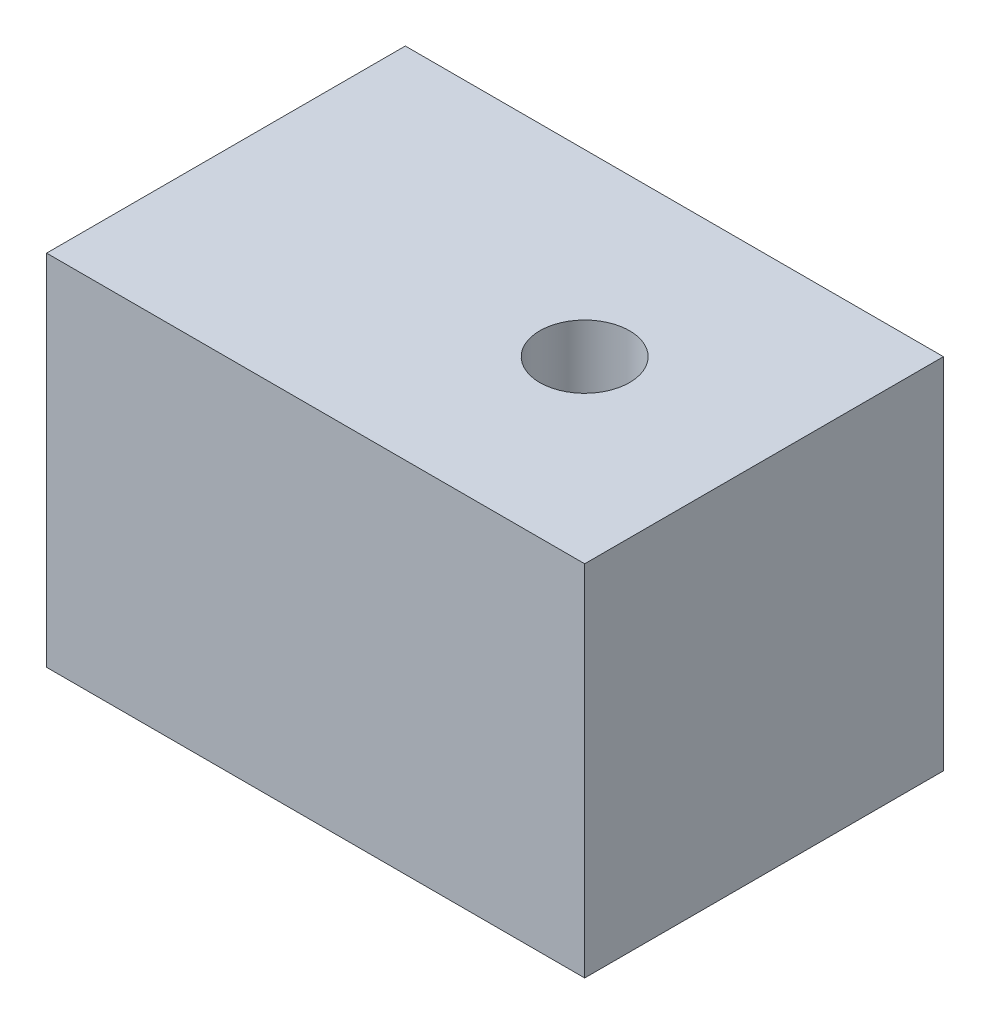
ISO-10303-21;
HEADER;
FILE_DESCRIPTION(('STEP AP214'),'2;1');
FILE_NAME('part.step','',(''),(''),'','','');
FILE_SCHEMA(('AUTOMOTIVE_DESIGN { 1 0 10303 214 1 1 1 1 }'));
ENDSEC;
DATA;
#1=APPLICATION_CONTEXT('core data for automotive mechanical design processes');
#2=APPLICATION_PROTOCOL_DEFINITION('international standard','automotive_design',2000,#1);
#3=PRODUCT_CONTEXT('',#1,'mechanical');
#4=PRODUCT('Part','Part','',(#3));
#5=PRODUCT_RELATED_PRODUCT_CATEGORY('part','',(#4));
#6=PRODUCT_DEFINITION_FORMATION('','',#4);
#7=PRODUCT_DEFINITION_CONTEXT('part definition',#1,'design');
#8=PRODUCT_DEFINITION('design','',#6,#7);
#9=PRODUCT_DEFINITION_SHAPE('','',#8);
#10=(LENGTH_UNIT() NAMED_UNIT(*) SI_UNIT(.MILLI.,.METRE.));
#11=(NAMED_UNIT(*) PLANE_ANGLE_UNIT() SI_UNIT($,.RADIAN.));
#12=(NAMED_UNIT(*) SI_UNIT($,.STERADIAN.) SOLID_ANGLE_UNIT());
#13=UNCERTAINTY_MEASURE_WITH_UNIT(LENGTH_MEASURE(1.E-05),#10,'distance_accuracy_value','');
#14=(GEOMETRIC_REPRESENTATION_CONTEXT(3) GLOBAL_UNCERTAINTY_ASSIGNED_CONTEXT((#13)) GLOBAL_UNIT_ASSIGNED_CONTEXT((#10,
#11,#12)) REPRESENTATION_CONTEXT('',''));
#15=CARTESIAN_POINT('',(0.,0.,0.));
#16=DIRECTION('',(0.,0.,1.));
#17=DIRECTION('',(1.,0.,0.));
#18=AXIS2_PLACEMENT_3D('',#15,#16,#17);
#19=CARTESIAN_POINT('',(19.05,25.4,12.7));
#20=DIRECTION('',(-1.,0.,0.));
#21=DIRECTION('',(0.,0.,1.));
#22=AXIS2_PLACEMENT_3D('',#19,#20,#21);
#23=PLANE('',#22);
#24=DIRECTION('',(0.,0.,-1.));
#25=VECTOR('',#24,1.);
#26=CARTESIAN_POINT('',(19.05,0.,12.7));
#27=LINE('',#26,#25);
#28=CARTESIAN_POINT('',(19.05,0.,12.7));
#29=VERTEX_POINT('',#28);
#30=CARTESIAN_POINT('',(19.05,0.,-12.7));
#31=VERTEX_POINT('',#30);
#32=EDGE_CURVE('E103',#29,#31,#27,.T.);
#33=ORIENTED_EDGE('',*,*,#32,.T.);
#34=DIRECTION('',(0.,-1.,0.));
#35=VECTOR('',#34,1.);
#36=CARTESIAN_POINT('',(19.05,25.4,-12.7));
#37=LINE('',#36,#35);
#38=CARTESIAN_POINT('',(19.05,25.4,-12.7));
#39=VERTEX_POINT('',#38);
#40=EDGE_CURVE('E11',#39,#31,#37,.T.);
#41=ORIENTED_EDGE('',*,*,#40,.F.);
#42=DIRECTION('',(0.,0.,-1.));
#43=VECTOR('',#42,1.);
#44=CARTESIAN_POINT('',(19.05,25.4,12.7));
#45=LINE('',#44,#43);
#46=CARTESIAN_POINT('',(19.05,25.4,12.7));
#47=VERTEX_POINT('',#46);
#48=EDGE_CURVE('E90',#47,#39,#45,.T.);
#49=ORIENTED_EDGE('',*,*,#48,.F.);
#50=DIRECTION('',(0.,-1.,0.));
#51=VECTOR('',#50,1.);
#52=CARTESIAN_POINT('',(19.05,25.4,12.7));
#53=LINE('',#52,#51);
#54=EDGE_CURVE('E99',#47,#29,#53,.T.);
#55=ORIENTED_EDGE('',*,*,#54,.T.);
#56=EDGE_LOOP('',(#33,#41,#49,#55));
#57=FACE_BOUND('',#56,.T.);
#58=ADVANCED_FACE('F37',(#57),#23,.F.);
#59=CARTESIAN_POINT('',(-19.05,25.4,-12.7));
#60=DIRECTION('',(0.,0.,1.));
#61=DIRECTION('',(1.,0.,0.));
#62=AXIS2_PLACEMENT_3D('',#59,#60,#61);
#63=PLANE('',#62);
#64=DIRECTION('',(-1.,0.,0.));
#65=VECTOR('',#64,1.);
#66=CARTESIAN_POINT('',(-19.05,0.,-12.7));
#67=LINE('',#66,#65);
#68=CARTESIAN_POINT('',(-19.05,0.,-12.7));
#69=VERTEX_POINT('',#68);
#70=EDGE_CURVE('E94',#31,#69,#67,.T.);
#71=ORIENTED_EDGE('',*,*,#70,.T.);
#72=DIRECTION('',(0.,-1.,0.));
#73=VECTOR('',#72,1.);
#74=CARTESIAN_POINT('',(-19.05,25.4,-12.7));
#75=LINE('',#74,#73);
#76=CARTESIAN_POINT('',(-19.05,25.4,-12.7));
#77=VERTEX_POINT('',#76);
#78=EDGE_CURVE('E46',#77,#69,#75,.T.);
#79=ORIENTED_EDGE('',*,*,#78,.F.);
#80=DIRECTION('',(-1.,0.,0.));
#81=VECTOR('',#80,1.);
#82=CARTESIAN_POINT('',(-19.05,25.4,-12.7));
#83=LINE('',#82,#81);
#84=EDGE_CURVE('E85',#39,#77,#83,.T.);
#85=ORIENTED_EDGE('',*,*,#84,.F.);
#86=ORIENTED_EDGE('',*,*,#40,.T.);
#87=EDGE_LOOP('',(#71,#79,#85,#86));
#88=FACE_BOUND('',#87,.T.);
#89=ADVANCED_FACE('F93',(#88),#63,.F.);
#90=CARTESIAN_POINT('',(-19.05,25.4,12.7));
#91=DIRECTION('',(1.,0.,0.));
#92=DIRECTION('',(0.,0.,-1.));
#93=AXIS2_PLACEMENT_3D('',#90,#91,#92);
#94=PLANE('',#93);
#95=CARTESIAN_POINT('',(-19.05,12.7,0.));
#96=DIRECTION('',(-1.,0.,0.));
#97=DIRECTION('',(0.,0.,1.));
#98=AXIS2_PLACEMENT_3D('',#95,#96,#97);
#99=CIRCLE('',#98,2.7051);
#100=CARTESIAN_POINT('',(-19.05,12.7,2.7051));
#101=VERTEX_POINT('',#100);
#102=EDGE_CURVE('E120',#101,#101,#99,.T.);
#103=ORIENTED_EDGE('',*,*,#102,.F.);
#104=EDGE_LOOP('',(#103));
#105=FACE_BOUND('',#104,.T.);
#106=DIRECTION('',(0.,0.,1.));
#107=VECTOR('',#106,1.);
#108=CARTESIAN_POINT('',(-19.05,0.,12.7));
#109=LINE('',#108,#107);
#110=CARTESIAN_POINT('',(-19.05,0.,12.7));
#111=VERTEX_POINT('',#110);
#112=EDGE_CURVE('E72',#69,#111,#109,.T.);
#113=ORIENTED_EDGE('',*,*,#112,.T.);
#114=DIRECTION('',(0.,-1.,0.));
#115=VECTOR('',#114,1.);
#116=CARTESIAN_POINT('',(-19.05,25.4,12.7));
#117=LINE('',#116,#115);
#118=CARTESIAN_POINT('',(-19.05,25.4,12.7));
#119=VERTEX_POINT('',#118);
#120=EDGE_CURVE('E95',#119,#111,#117,.T.);
#121=ORIENTED_EDGE('',*,*,#120,.F.);
#122=DIRECTION('',(0.,0.,1.));
#123=VECTOR('',#122,1.);
#124=CARTESIAN_POINT('',(-19.05,25.4,12.7));
#125=LINE('',#124,#123);
#126=EDGE_CURVE('E88',#77,#119,#125,.T.);
#127=ORIENTED_EDGE('',*,*,#126,.F.);
#128=ORIENTED_EDGE('',*,*,#78,.T.);
#129=EDGE_LOOP('',(#113,#121,#127,#128));
#130=FACE_BOUND('',#129,.T.);
#131=ADVANCED_FACE('F97',(#105,#130),#94,.F.);
#132=CARTESIAN_POINT('',(-19.05,25.4,12.7));
#133=DIRECTION('',(0.,0.,-1.));
#134=DIRECTION('',(-1.,0.,0.));
#135=AXIS2_PLACEMENT_3D('',#132,#133,#134);
#136=PLANE('',#135);
#137=DIRECTION('',(1.,0.,0.));
#138=VECTOR('',#137,1.);
#139=CARTESIAN_POINT('',(-19.05,0.,12.7));
#140=LINE('',#139,#138);
#141=EDGE_CURVE('E78',#111,#29,#140,.T.);
#142=ORIENTED_EDGE('',*,*,#141,.T.);
#143=ORIENTED_EDGE('',*,*,#54,.F.);
#144=DIRECTION('',(1.,0.,0.));
#145=VECTOR('',#144,1.);
#146=CARTESIAN_POINT('',(-19.05,25.4,12.7));
#147=LINE('',#146,#145);
#148=EDGE_CURVE('E55',#119,#47,#147,.T.);
#149=ORIENTED_EDGE('',*,*,#148,.F.);
#150=ORIENTED_EDGE('',*,*,#120,.T.);
#151=EDGE_LOOP('',(#142,#143,#149,#150));
#152=FACE_BOUND('',#151,.T.);
#153=ADVANCED_FACE('F155',(#152),#136,.F.);
#154=CARTESIAN_POINT('',(0.,25.4,0.));
#155=DIRECTION('',(0.,-1.,0.));
#156=DIRECTION('',(0.,0.,-1.));
#157=AXIS2_PLACEMENT_3D('',#154,#155,#156);
#158=PLANE('',#157);
#159=CARTESIAN_POINT('',(6.34999999999999,25.4,0.));
#160=DIRECTION('',(0.,1.,0.));
#161=DIRECTION('',(0.,0.,1.));
#162=AXIS2_PLACEMENT_3D('',#159,#160,#161);
#163=CIRCLE('',#162,3.18);
#164=CARTESIAN_POINT('',(6.34999999999999,25.4,3.18));
#165=VERTEX_POINT('',#164);
#166=EDGE_CURVE('E173',#165,#165,#163,.T.);
#167=ORIENTED_EDGE('',*,*,#166,.F.);
#168=EDGE_LOOP('',(#167));
#169=FACE_BOUND('',#168,.T.);
#170=ORIENTED_EDGE('',*,*,#48,.T.);
#171=ORIENTED_EDGE('',*,*,#84,.T.);
#172=ORIENTED_EDGE('',*,*,#126,.T.);
#173=ORIENTED_EDGE('',*,*,#148,.T.);
#174=EDGE_LOOP('',(#170,#171,#172,#173));
#175=FACE_BOUND('',#174,.T.);
#176=ADVANCED_FACE('F86',(#169,#175),#158,.F.);
#177=CARTESIAN_POINT('',(0.,0.,0.));
#178=DIRECTION('',(0.,-1.,0.));
#179=DIRECTION('',(0.,0.,-1.));
#180=AXIS2_PLACEMENT_3D('',#177,#178,#179);
#181=PLANE('',#180);
#182=CARTESIAN_POINT('',(6.34999999999999,0.,0.));
#183=DIRECTION('',(0.,-1.,0.));
#184=DIRECTION('',(0.,0.,-1.));
#185=AXIS2_PLACEMENT_3D('',#182,#183,#184);
#186=CIRCLE('',#185,1.5875);
#187=CARTESIAN_POINT('',(6.34999999999999,0.,-1.5875));
#188=VERTEX_POINT('',#187);
#189=EDGE_CURVE('E178',#188,#188,#186,.T.);
#190=ORIENTED_EDGE('',*,*,#189,.F.);
#191=EDGE_LOOP('',(#190));
#192=FACE_BOUND('',#191,.T.);
#193=ORIENTED_EDGE('',*,*,#32,.F.);
#194=ORIENTED_EDGE('',*,*,#141,.F.);
#195=ORIENTED_EDGE('',*,*,#112,.F.);
#196=ORIENTED_EDGE('',*,*,#70,.F.);
#197=EDGE_LOOP('',(#193,#194,#195,#196));
#198=FACE_BOUND('',#197,.T.);
#199=ADVANCED_FACE('F139',(#192,#198),#181,.T.);
#200=CARTESIAN_POINT('',(-1.82,12.7,0.));
#201=DIRECTION('',(-1.,0.,0.));
#202=DIRECTION('',(0.,0.,1.));
#203=AXIS2_PLACEMENT_3D('',#200,#201,#202);
#204=CONICAL_SURFACE('',#203,2.7051,1.02974425867665);
#205=CARTESIAN_POINT('',(-1.82,12.7,0.));
#206=DIRECTION('',(-1.,0.,0.));
#207=DIRECTION('',(0.,0.,1.));
#208=AXIS2_PLACEMENT_3D('',#205,#206,#207);
#209=CIRCLE('',#208,2.7051);
#210=CARTESIAN_POINT('',(-1.82,12.7,2.7051));
#211=VERTEX_POINT('',#210);
#212=EDGE_CURVE('E113',#211,#211,#209,.T.);
#213=ORIENTED_EDGE('',*,*,#212,.T.);
#214=EDGE_LOOP('',(#213));
#215=FACE_BOUND('',#214,.T.);
#216=CARTESIAN_POINT('',(-1.1484781721748,12.7,0.));
#217=DIRECTION('',(-1.,0.,0.));
#218=DIRECTION('',(0.,0.,1.));
#219=AXIS2_PLACEMENT_3D('',#216,#217,#218);
#220=CIRCLE('',#219,1.5875);
#221=CARTESIAN_POINT('',(-1.1484781721748,12.7,1.5875));
#222=VERTEX_POINT('',#221);
#223=EDGE_CURVE('E106',#222,#222,#220,.T.);
#224=ORIENTED_EDGE('',*,*,#223,.F.);
#225=EDGE_LOOP('',(#224));
#226=FACE_BOUND('',#225,.T.);
#227=ADVANCED_FACE('F136',(#215,#226),#204,.F.);
#228=CARTESIAN_POINT('',(-19.05,12.7,0.));
#229=DIRECTION('',(-1.,0.,0.));
#230=DIRECTION('',(0.,0.,1.));
#231=AXIS2_PLACEMENT_3D('',#228,#229,#230);
#232=CYLINDRICAL_SURFACE('',#231,2.7051);
#233=ORIENTED_EDGE('',*,*,#212,.F.);
#234=EDGE_LOOP('',(#233));
#235=FACE_BOUND('',#234,.T.);
#236=ORIENTED_EDGE('',*,*,#102,.T.);
#237=EDGE_LOOP('',(#236));
#238=FACE_BOUND('',#237,.T.);
#239=ADVANCED_FACE('F134',(#235,#238),#232,.F.);
#240=CARTESIAN_POINT('',(6.35,12.7,0.));
#241=DIRECTION('',(-1.,0.,0.));
#242=DIRECTION('',(0.,0.,1.));
#243=AXIS2_PLACEMENT_3D('',#240,#241,#242);
#244=CYLINDRICAL_SURFACE('',#243,1.5875);
#245=CARTESIAN_POINT('',(3.59459735247278,12.7,1.5875));
#246=CARTESIAN_POINT('',(3.59459017973115,12.6172586451815,1.58749424352326));
#247=CARTESIAN_POINT('',(3.59081379270054,12.5344123573323,1.58098805091278));
#248=CARTESIAN_POINT('',(3.57625445945613,12.3712609331309,1.55529417728205));
#249=CARTESIAN_POINT('',(3.56545674467661,12.2909615280847,1.53607976450222));
#250=CARTESIAN_POINT('',(3.53841847516626,12.1355716685185,1.48600354904247));
#251=CARTESIAN_POINT('',(3.52220683202264,12.0604560495693,1.45520350806727));
#252=CARTESIAN_POINT('',(3.48621220218651,11.9164772370036,1.38301884589355));
#253=CARTESIAN_POINT('',(3.46642903195907,11.8476143649792,1.34163368069724));
#254=CARTESIAN_POINT('',(3.42353292885979,11.7118440015256,1.24546401127066));
#255=CARTESIAN_POINT('',(3.40027996086801,11.6455625972824,1.18985768475747));
#256=CARTESIAN_POINT('',(3.35419481091718,11.5227798929066,1.06853328284142));
#257=CARTESIAN_POINT('',(3.33136284330224,11.4662834580961,1.00281020764799));
#258=CARTESIAN_POINT('',(3.28685847808196,11.360961824106,0.857724983900029));
#259=CARTESIAN_POINT('',(3.26536687018225,11.312906398233,0.777743356355027));
#260=CARTESIAN_POINT('',(3.22778228141889,11.2312185260838,0.609557105389736));
#261=CARTESIAN_POINT('',(3.21168590540129,11.1975770055885,0.521357698151404));
#262=CARTESIAN_POINT('',(3.18771457578681,11.1481502513833,0.345872396540025));
#263=CARTESIAN_POINT('',(3.17933723296006,11.1312672267198,0.258965884567842));
#264=CARTESIAN_POINT('',(3.16987262306143,11.1122219707399,0.0831811124203533));
#265=CARTESIAN_POINT('',(3.16878096091756,11.1100508644766,-0.00569592656257327));
#266=CARTESIAN_POINT('',(3.17377207384302,11.1200661320866,-0.174647475104287));
#267=CARTESIAN_POINT('',(3.17924107276919,11.1310241157808,-0.254817124449576));
#268=CARTESIAN_POINT('',(3.19581219524633,11.1647890080791,-0.412002819966045));
#269=CARTESIAN_POINT('',(3.20691474020997,11.1875968031013,-0.489018629751079));
#270=CARTESIAN_POINT('',(3.23392807500225,11.2445632875032,-0.639056107868877));
#271=CARTESIAN_POINT('',(3.24990341674929,11.2788750199864,-0.712007564890726));
#272=CARTESIAN_POINT('',(3.28522120367903,11.3576645687765,-0.851293928775306));
#273=CARTESIAN_POINT('',(3.30456485498222,11.4021460284395,-0.917626452108219));
#274=CARTESIAN_POINT('',(3.34695473281455,11.5048320693497,-1.04846685880464));
#275=CARTESIAN_POINT('',(3.37017809939693,11.5639352328471,-1.11221270222715));
#276=CARTESIAN_POINT('',(3.41653797397157,11.6917812534189,-1.22929818245982));
#277=CARTESIAN_POINT('',(3.43967440233729,11.760531418167,-1.28262985652666));
#278=CARTESIAN_POINT('',(3.48482268882283,11.9110365592306,-1.38067211668293));
#279=CARTESIAN_POINT('',(3.50667124180246,11.9933386428224,-1.42462551406329));
#280=CARTESIAN_POINT('',(3.54448607037906,12.1655131829884,-1.49773248108117));
#281=CARTESIAN_POINT('',(3.56045846359268,12.2553776459481,-1.52690145467056));
#282=CARTESIAN_POINT('',(3.58293846121488,12.4326412863022,-1.56724860622443));
#283=CARTESIAN_POINT('',(3.59009525222214,12.5196724266027,-1.57966823448581));
#284=CARTESIAN_POINT('',(3.59597898000884,12.6948487252,-1.58990943690627));
#285=CARTESIAN_POINT('',(3.59471182848113,12.7829930589395,-1.58774124838393));
#286=CARTESIAN_POINT('',(3.58457936408537,12.94766195798,-1.57000789995042));
#287=CARTESIAN_POINT('',(3.5765563554147,13.0244067507227,-1.55592709614486));
#288=CARTESIAN_POINT('',(3.55505914774963,13.1742990175549,-1.51696959876538));
#289=CARTESIAN_POINT('',(3.5415831905134,13.2474453228123,-1.49208942286734));
#290=CARTESIAN_POINT('',(3.50996663190253,13.3919196717243,-1.43102747427171));
#291=CARTESIAN_POINT('',(3.4916388369675,13.4630064531439,-1.39437548647248));
#292=CARTESIAN_POINT('',(3.45255105832485,13.5984311680242,-1.31122057310551));
#293=CARTESIAN_POINT('',(3.43178982816571,13.6627656105492,-1.26471258916849));
#294=CARTESIAN_POINT('',(3.38704059457924,13.7913113395254,-1.15633902713417));
#295=CARTESIAN_POINT('',(3.36297478295081,13.8544925973242,-1.09327829186976));
#296=CARTESIAN_POINT('',(3.31658705563695,13.9696981239001,-0.957069080559218));
#297=CARTESIAN_POINT('',(3.29426572472186,14.0217186615848,-0.883917244386321));
#298=CARTESIAN_POINT('',(3.25312475028506,14.1142693182605,-0.72698308960269));
#299=CARTESIAN_POINT('',(3.23441160133442,14.1544644199909,-0.642973300455064));
#300=CARTESIAN_POINT('',(3.20340547382718,14.2197514379056,-0.468181532553601));
#301=CARTESIAN_POINT('',(3.1911068764652,14.2448565750436,-0.377405560558901));
#302=CARTESIAN_POINT('',(3.17520986541585,14.2770933180386,-0.200631930742875));
#303=CARTESIAN_POINT('',(3.17091790575939,14.2856602409293,-0.114957875348021));
#304=CARTESIAN_POINT('',(3.16934893418396,14.2888052046608,0.0566986290222037));
#305=CARTESIAN_POINT('',(3.17206948238109,14.2833881110034,0.142680960343026));
#306=CARTESIAN_POINT('',(3.18381556240842,14.2596710385933,0.306578938234516));
#307=CARTESIAN_POINT('',(3.19241607544889,14.2422388855655,0.384653888868625));
#308=CARTESIAN_POINT('',(3.21466655569703,14.1961544416323,0.536644645906985));
#309=CARTESIAN_POINT('',(3.22831724919192,14.1675005368458,0.6105598523189));
#310=CARTESIAN_POINT('',(3.26016376584061,14.0985062120038,0.755691196560387));
#311=CARTESIAN_POINT('',(3.27852931342509,14.0577175548832,0.826655881706155));
#312=CARTESIAN_POINT('',(3.31788266979807,13.9661749117067,0.961027907457518));
#313=CARTESIAN_POINT('',(3.33887168193045,13.9154163464585,1.02443175377236));
#314=CARTESIAN_POINT('',(3.38384275960468,13.7995336377291,1.14851463256916));
#315=CARTESIAN_POINT('',(3.40791513752554,13.7334837307898,1.20829873425025));
#316=CARTESIAN_POINT('',(3.45460340160479,13.5919291585893,1.31626265509524));
#317=CARTESIAN_POINT('',(3.47721799344547,13.5164162619043,1.36443226335599));
#318=CARTESIAN_POINT('',(3.51893220161945,13.3549548593926,1.44905309202634));
#319=CARTESIAN_POINT('',(3.5379005157957,13.2687547108248,1.48509294153698));
#320=CARTESIAN_POINT('',(3.56846262003712,13.0903067674611,1.54159277685558));
#321=CARTESIAN_POINT('',(3.58008105831814,12.9980803427105,1.5621048818226));
#322=CARTESIAN_POINT('',(3.58952400815211,12.8707121092778,1.5786666263393));
#323=CARTESIAN_POINT('',(3.59141986080972,12.8366886801025,1.58197404174185));
#324=CARTESIAN_POINT('',(3.59395805863416,12.7684494966913,1.58639199272779));
#325=CARTESIAN_POINT('',(3.59460032015078,12.7342337297739,1.58750238170706));
#326=CARTESIAN_POINT('',(3.59459735247278,12.7,1.5875));
#327=B_SPLINE_CURVE_WITH_KNOTS('',3,(#245,#246,#247,#248,#249,#250,#251,#252,#253,#254,#255,
#256,#257,#258,#259,#260,#261,#262,#263,#264,#265,#266,#267,#268,#269,#270,#271,#272,#273,#274,
#275,#276,#277,#278,#279,#280,#281,#282,#283,#284,#285,#286,#287,#288,#289,#290,#291,#292,#293,
#294,#295,#296,#297,#298,#299,#300,#301,#302,#303,#304,#305,#306,#307,#308,#309,#310,#311,#312,
#313,#314,#315,#316,#317,#318,#319,#320,#321,#322,#323,#324,#325,#326),.UNSPECIFIED.,.T.,.F.,(4,
2,2,2,2,2,2,2,2,2,2,2,2,2,2,2,2,2,2,2,2,2,2,2,2,2,2,2,2,2,2,2,2,2,2,2,2,2,2,2,4),(0.,
0.248080020271847,0.496683543991013,0.743980151316304,0.991289470428681,1.25892872375786,
1.52670067407902,1.81245176451593,2.0980226961702,2.36332722852483,2.62847170198454,
2.87062973089973,3.11280587691319,3.35834086805633,3.60396396157384,3.87275128477826,
4.14174332668465,4.4277236947209,4.71340548295741,4.97647097858047,5.23935188152003,
5.47361049557589,5.70794470394838,5.95313604978692,6.1984535406753,6.47457780486636,
6.75079423563348,7.03421370092675,7.31738448715514,7.57462555781747,7.83177713786769,
8.07207098604627,8.31239940531318,8.56302803138897,8.81377204185594,9.08940124036585,
9.36527188239796,9.64972845486001,9.93322595761687,10.0358607011136,10.1385022930347),.UNSPECIFIED.);
#328=CARTESIAN_POINT('',(3.59459735247278,12.7,1.5875));
#329=VERTEX_POINT('',#328);
#330=EDGE_CURVE('E114',#329,#329,#327,.T.);
#331=ORIENTED_EDGE('',*,*,#330,.T.);
#332=EDGE_LOOP('',(#331));
#333=FACE_BOUND('',#332,.T.);
#334=ORIENTED_EDGE('',*,*,#223,.T.);
#335=EDGE_LOOP('',(#334));
#336=FACE_BOUND('',#335,.T.);
#337=ADVANCED_FACE('F122',(#333,#336),#244,.F.);
#338=CARTESIAN_POINT('',(6.34999999999999,9.525,0.));
#339=DIRECTION('',(0.,1.,0.));
#340=DIRECTION('',(0.,0.,1.));
#341=AXIS2_PLACEMENT_3D('',#338,#339,#340);
#342=CYLINDRICAL_SURFACE('',#341,3.18);
#343=ORIENTED_EDGE('',*,*,#166,.T.);
#344=EDGE_LOOP('',(#343));
#345=FACE_BOUND('',#344,.T.);
#346=CARTESIAN_POINT('',(6.34999999999999,9.525,0.));
#347=DIRECTION('',(0.,1.,0.));
#348=DIRECTION('',(0.,0.,1.));
#349=AXIS2_PLACEMENT_3D('',#346,#347,#348);
#350=CIRCLE('',#349,3.18);
#351=CARTESIAN_POINT('',(6.34999999999999,9.525,3.18));
#352=VERTEX_POINT('',#351);
#353=EDGE_CURVE('E121',#352,#352,#350,.T.);
#354=ORIENTED_EDGE('',*,*,#353,.F.);
#355=EDGE_LOOP('',(#354));
#356=FACE_BOUND('',#355,.T.);
#357=ORIENTED_EDGE('',*,*,#330,.F.);
#358=EDGE_LOOP('',(#357));
#359=FACE_BOUND('',#358,.T.);
#360=ADVANCED_FACE('F126',(#345,#356,#359),#342,.F.);
#361=CARTESIAN_POINT('',(6.34999999999999,9.525,0.));
#362=DIRECTION('',(0.,1.,0.));
#363=DIRECTION('',(0.,0.,1.));
#364=AXIS2_PLACEMENT_3D('',#361,#362,#363);
#365=PLANE('',#364);
#366=CARTESIAN_POINT('',(6.34999999999999,9.525,0.));
#367=DIRECTION('',(0.,1.,0.));
#368=DIRECTION('',(0.,0.,1.));
#369=AXIS2_PLACEMENT_3D('',#366,#367,#368);
#370=CIRCLE('',#369,1.5875);
#371=CARTESIAN_POINT('',(6.34999999999999,9.525,1.5875));
#372=VERTEX_POINT('',#371);
#373=EDGE_CURVE('E40',#372,#372,#370,.T.);
#374=ORIENTED_EDGE('',*,*,#373,.F.);
#375=EDGE_LOOP('',(#374));
#376=FACE_BOUND('',#375,.T.);
#377=ORIENTED_EDGE('',*,*,#353,.T.);
#378=EDGE_LOOP('',(#377));
#379=FACE_BOUND('',#378,.T.);
#380=ADVANCED_FACE('F131',(#376,#379),#365,.T.);
#381=CARTESIAN_POINT('',(6.34999999999999,25.4,0.));
#382=DIRECTION('',(0.,-1.,0.));
#383=DIRECTION('',(0.,0.,-1.));
#384=AXIS2_PLACEMENT_3D('',#381,#382,#383);
#385=CYLINDRICAL_SURFACE('',#384,1.5875);
#386=ORIENTED_EDGE('',*,*,#373,.T.);
#387=EDGE_LOOP('',(#386));
#388=FACE_BOUND('',#387,.T.);
#389=ORIENTED_EDGE('',*,*,#189,.T.);
#390=EDGE_LOOP('',(#389));
#391=FACE_BOUND('',#390,.T.);
#392=ADVANCED_FACE('F185',(#388,#391),#385,.F.);
#393=CLOSED_SHELL('',(#58,#89,#131,#153,#176,#199,#227,#239,#337,#360,#380,#392));
#394=MANIFOLD_SOLID_BREP('B2',#393);
#395=ADVANCED_BREP_SHAPE_REPRESENTATION('',(#18,#394),#14);
#396=SHAPE_DEFINITION_REPRESENTATION(#9,#395);
ENDSEC;
END-ISO-10303-21;
